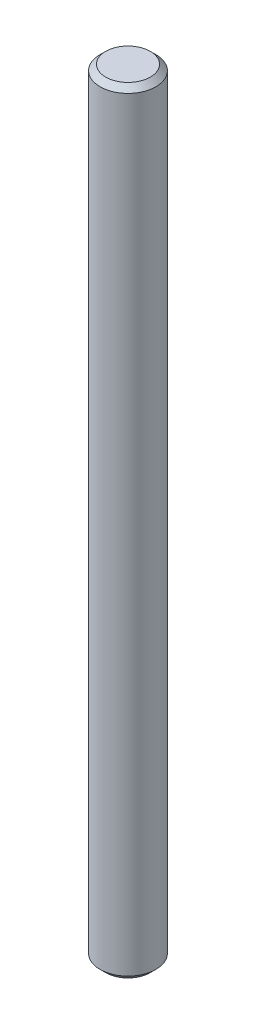
ISO-10303-21;
HEADER;
FILE_DESCRIPTION(('STEP AP214'),'2;1');
FILE_NAME('part.step','',(''),(''),'','','');
FILE_SCHEMA(('AUTOMOTIVE_DESIGN { 1 0 10303 214 1 1 1 1 }'));
ENDSEC;
DATA;
#1=APPLICATION_CONTEXT('core data for automotive mechanical design processes');
#2=APPLICATION_PROTOCOL_DEFINITION('international standard','automotive_design',2000,#1);
#3=PRODUCT_CONTEXT('',#1,'mechanical');
#4=PRODUCT('Part','Part','',(#3));
#5=PRODUCT_RELATED_PRODUCT_CATEGORY('part','',(#4));
#6=PRODUCT_DEFINITION_FORMATION('','',#4);
#7=PRODUCT_DEFINITION_CONTEXT('part definition',#1,'design');
#8=PRODUCT_DEFINITION('design','',#6,#7);
#9=PRODUCT_DEFINITION_SHAPE('','',#8);
#10=(LENGTH_UNIT() NAMED_UNIT(*) SI_UNIT(.MILLI.,.METRE.));
#11=(NAMED_UNIT(*) PLANE_ANGLE_UNIT() SI_UNIT($,.RADIAN.));
#12=(NAMED_UNIT(*) SI_UNIT($,.STERADIAN.) SOLID_ANGLE_UNIT());
#13=UNCERTAINTY_MEASURE_WITH_UNIT(LENGTH_MEASURE(1.E-05),#10,'distance_accuracy_value','');
#14=(GEOMETRIC_REPRESENTATION_CONTEXT(3) GLOBAL_UNCERTAINTY_ASSIGNED_CONTEXT((#13)) GLOBAL_UNIT_ASSIGNED_CONTEXT((#10,
#11,#12)) REPRESENTATION_CONTEXT('',''));
#15=CARTESIAN_POINT('',(0.,0.,0.));
#16=DIRECTION('',(0.,0.,1.));
#17=DIRECTION('',(1.,0.,0.));
#18=AXIS2_PLACEMENT_3D('',#15,#16,#17);
#19=CARTESIAN_POINT('',(0.,69.5,0.));
#20=DIRECTION('',(0.,-1.,0.));
#21=DIRECTION('',(0.,0.,-1.));
#22=AXIS2_PLACEMENT_3D('',#19,#20,#21);
#23=CYLINDRICAL_SURFACE('',#22,5.);
#24=CARTESIAN_POINT('',(0.,-68.5,0.));
#25=DIRECTION('',(0.,1.,0.));
#26=DIRECTION('',(0.,0.,1.));
#27=AXIS2_PLACEMENT_3D('',#24,#25,#26);
#28=CIRCLE('',#27,5.);
#29=CARTESIAN_POINT('',(0.,-68.5,5.));
#30=VERTEX_POINT('',#29);
#31=EDGE_CURVE('E42',#30,#30,#28,.T.);
#32=ORIENTED_EDGE('',*,*,#31,.T.);
#33=EDGE_LOOP('',(#32));
#34=FACE_BOUND('',#33,.T.);
#35=CARTESIAN_POINT('',(0.,68.5,0.));
#36=DIRECTION('',(0.,1.,0.));
#37=DIRECTION('',(0.,0.,1.));
#38=AXIS2_PLACEMENT_3D('',#35,#36,#37);
#39=CIRCLE('',#38,5.);
#40=CARTESIAN_POINT('',(0.,68.5,5.));
#41=VERTEX_POINT('',#40);
#42=EDGE_CURVE('E46',#41,#41,#39,.F.);
#43=ORIENTED_EDGE('',*,*,#42,.T.);
#44=EDGE_LOOP('',(#43));
#45=FACE_BOUND('',#44,.T.);
#46=ADVANCED_FACE('F31',(#34,#45),#23,.T.);
#47=CARTESIAN_POINT('',(0.,69.5,0.));
#48=DIRECTION('',(0.,1.,0.));
#49=DIRECTION('',(0.,0.,1.));
#50=AXIS2_PLACEMENT_3D('',#47,#48,#49);
#51=PLANE('',#50);
#52=CARTESIAN_POINT('',(0.,69.5,0.));
#53=DIRECTION('',(0.,1.,0.));
#54=DIRECTION('',(0.,0.,1.));
#55=AXIS2_PLACEMENT_3D('',#52,#53,#54);
#56=CIRCLE('',#55,4.00000000000002);
#57=CARTESIAN_POINT('',(0.,69.5,4.00000000000002));
#58=VERTEX_POINT('',#57);
#59=EDGE_CURVE('E10',#58,#58,#56,.T.);
#60=ORIENTED_EDGE('',*,*,#59,.T.);
#61=EDGE_LOOP('',(#60));
#62=FACE_BOUND('',#61,.T.);
#63=ADVANCED_FACE('F62',(#62),#51,.T.);
#64=CARTESIAN_POINT('',(0.,-69.5,0.));
#65=DIRECTION('',(0.,1.,0.));
#66=DIRECTION('',(0.,0.,1.));
#67=AXIS2_PLACEMENT_3D('',#64,#65,#66);
#68=PLANE('',#67);
#69=CARTESIAN_POINT('',(0.,-69.5,0.));
#70=DIRECTION('',(0.,1.,0.));
#71=DIRECTION('',(0.,0.,1.));
#72=AXIS2_PLACEMENT_3D('',#69,#70,#71);
#73=CIRCLE('',#72,4.);
#74=CARTESIAN_POINT('',(0.,-69.5,4.));
#75=VERTEX_POINT('',#74);
#76=EDGE_CURVE('E38',#75,#75,#73,.F.);
#77=ORIENTED_EDGE('',*,*,#76,.T.);
#78=EDGE_LOOP('',(#77));
#79=FACE_BOUND('',#78,.T.);
#80=ADVANCED_FACE('F59',(#79),#68,.F.);
#81=CARTESIAN_POINT('',(0.,-68.5,0.));
#82=DIRECTION('',(0.,1.,0.));
#83=DIRECTION('',(0.,0.,1.));
#84=AXIS2_PLACEMENT_3D('',#81,#82,#83);
#85=CONICAL_SURFACE('',#84,5.,0.785398163397446);
#86=ORIENTED_EDGE('',*,*,#76,.F.);
#87=EDGE_LOOP('',(#86));
#88=FACE_BOUND('',#87,.T.);
#89=ORIENTED_EDGE('',*,*,#31,.F.);
#90=EDGE_LOOP('',(#89));
#91=FACE_BOUND('',#90,.T.);
#92=ADVANCED_FACE('F55',(#88,#91),#85,.T.);
#93=CARTESIAN_POINT('',(0.,69.5,0.));
#94=DIRECTION('',(0.,-1.,0.));
#95=DIRECTION('',(0.,0.,-1.));
#96=AXIS2_PLACEMENT_3D('',#93,#94,#95);
#97=CONICAL_SURFACE('',#96,4.00000000000002,0.785398163397446);
#98=ORIENTED_EDGE('',*,*,#42,.F.);
#99=EDGE_LOOP('',(#98));
#100=FACE_BOUND('',#99,.T.);
#101=ORIENTED_EDGE('',*,*,#59,.F.);
#102=EDGE_LOOP('',(#101));
#103=FACE_BOUND('',#102,.T.);
#104=ADVANCED_FACE('F33',(#100,#103),#97,.T.);
#105=CLOSED_SHELL('',(#46,#63,#80,#92,#104));
#106=MANIFOLD_SOLID_BREP('B2',#105);
#107=ADVANCED_BREP_SHAPE_REPRESENTATION('',(#18,#106),#14);
#108=SHAPE_DEFINITION_REPRESENTATION(#9,#107);
ENDSEC;
END-ISO-10303-21;
